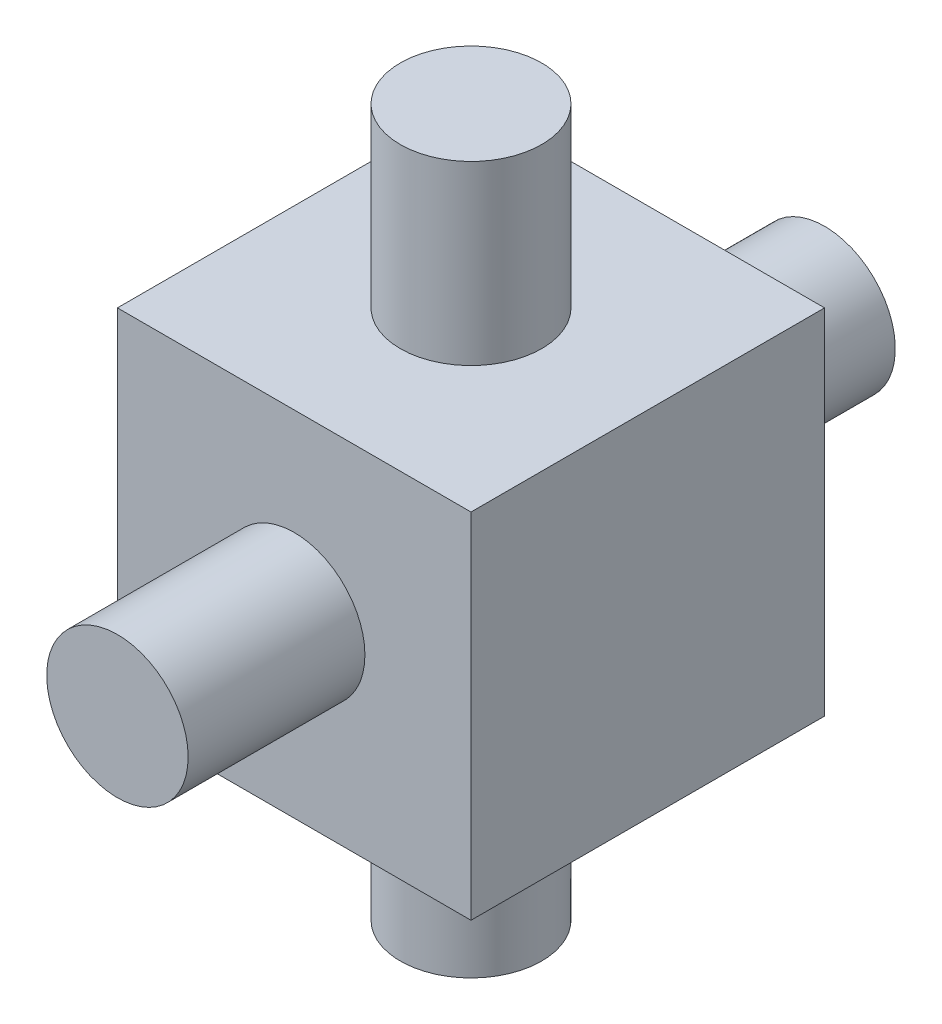
ISO-10303-21;
HEADER;
FILE_DESCRIPTION(('STEP AP214'),'2;1');
FILE_NAME('part.step','',(''),(''),'','','');
FILE_SCHEMA(('AUTOMOTIVE_DESIGN { 1 0 10303 214 1 1 1 1 }'));
ENDSEC;
DATA;
#1=APPLICATION_CONTEXT('core data for automotive mechanical design processes');
#2=APPLICATION_PROTOCOL_DEFINITION('international standard','automotive_design',2000,#1);
#3=PRODUCT_CONTEXT('',#1,'mechanical');
#4=PRODUCT('Part','Part','',(#3));
#5=PRODUCT_RELATED_PRODUCT_CATEGORY('part','',(#4));
#6=PRODUCT_DEFINITION_FORMATION('','',#4);
#7=PRODUCT_DEFINITION_CONTEXT('part definition',#1,'design');
#8=PRODUCT_DEFINITION('design','',#6,#7);
#9=PRODUCT_DEFINITION_SHAPE('','',#8);
#10=(LENGTH_UNIT() NAMED_UNIT(*) SI_UNIT(.MILLI.,.METRE.));
#11=(NAMED_UNIT(*) PLANE_ANGLE_UNIT() SI_UNIT($,.RADIAN.));
#12=(NAMED_UNIT(*) SI_UNIT($,.STERADIAN.) SOLID_ANGLE_UNIT());
#13=UNCERTAINTY_MEASURE_WITH_UNIT(LENGTH_MEASURE(1.E-05),#10,'distance_accuracy_value','');
#14=(GEOMETRIC_REPRESENTATION_CONTEXT(3) GLOBAL_UNCERTAINTY_ASSIGNED_CONTEXT((#13)) GLOBAL_UNIT_ASSIGNED_CONTEXT((#10,
#11,#12)) REPRESENTATION_CONTEXT('',''));
#15=CARTESIAN_POINT('',(0.,0.,0.));
#16=DIRECTION('',(0.,0.,1.));
#17=DIRECTION('',(1.,0.,0.));
#18=AXIS2_PLACEMENT_3D('',#15,#16,#17);
#19=CARTESIAN_POINT('',(10.,10.,-10.));
#20=DIRECTION('',(-1.,0.,0.));
#21=DIRECTION('',(0.,0.,1.));
#22=AXIS2_PLACEMENT_3D('',#19,#20,#21);
#23=PLANE('',#22);
#24=DIRECTION('',(0.,0.,-1.));
#25=VECTOR('',#24,1.);
#26=CARTESIAN_POINT('',(10.,-10.,-10.));
#27=LINE('',#26,#25);
#28=CARTESIAN_POINT('',(10.,-10.,10.));
#29=VERTEX_POINT('',#28);
#30=CARTESIAN_POINT('',(10.,-10.,-10.));
#31=VERTEX_POINT('',#30);
#32=EDGE_CURVE('E102',#29,#31,#27,.T.);
#33=ORIENTED_EDGE('',*,*,#32,.T.);
#34=DIRECTION('',(0.,-1.,0.));
#35=VECTOR('',#34,1.);
#36=CARTESIAN_POINT('',(10.,10.,-10.));
#37=LINE('',#36,#35);
#38=CARTESIAN_POINT('',(10.,10.,-10.));
#39=VERTEX_POINT('',#38);
#40=EDGE_CURVE('E38',#39,#31,#37,.T.);
#41=ORIENTED_EDGE('',*,*,#40,.F.);
#42=DIRECTION('',(0.,0.,-1.));
#43=VECTOR('',#42,1.);
#44=CARTESIAN_POINT('',(10.,10.,-10.));
#45=LINE('',#44,#43);
#46=CARTESIAN_POINT('',(10.,10.,10.));
#47=VERTEX_POINT('',#46);
#48=EDGE_CURVE('E89',#47,#39,#45,.T.);
#49=ORIENTED_EDGE('',*,*,#48,.F.);
#50=DIRECTION('',(0.,-1.,0.));
#51=VECTOR('',#50,1.);
#52=CARTESIAN_POINT('',(10.,10.,10.));
#53=LINE('',#52,#51);
#54=EDGE_CURVE('E98',#47,#29,#53,.T.);
#55=ORIENTED_EDGE('',*,*,#54,.T.);
#56=EDGE_LOOP('',(#33,#41,#49,#55));
#57=FACE_BOUND('',#56,.T.);
#58=ADVANCED_FACE('F35',(#57),#23,.F.);
#59=CARTESIAN_POINT('',(-10.,10.,-10.));
#60=DIRECTION('',(0.,0.,1.));
#61=DIRECTION('',(1.,0.,0.));
#62=AXIS2_PLACEMENT_3D('',#59,#60,#61);
#63=PLANE('',#62);
#64=CARTESIAN_POINT('',(0.,0.,-10.));
#65=DIRECTION('',(0.,0.,-1.));
#66=DIRECTION('',(-1.,0.,0.));
#67=AXIS2_PLACEMENT_3D('',#64,#65,#66);
#68=CIRCLE('',#67,4.);
#69=CARTESIAN_POINT('',(-4.,0.,-10.));
#70=VERTEX_POINT('',#69);
#71=EDGE_CURVE('E116',#70,#70,#68,.T.);
#72=ORIENTED_EDGE('',*,*,#71,.F.);
#73=EDGE_LOOP('',(#72));
#74=FACE_BOUND('',#73,.T.);
#75=DIRECTION('',(-1.,0.,0.));
#76=VECTOR('',#75,1.);
#77=CARTESIAN_POINT('',(-10.,-10.,-10.));
#78=LINE('',#77,#76);
#79=CARTESIAN_POINT('',(-10.,-10.,-10.));
#80=VERTEX_POINT('',#79);
#81=EDGE_CURVE('E94',#31,#80,#78,.T.);
#82=ORIENTED_EDGE('',*,*,#81,.T.);
#83=DIRECTION('',(0.,-1.,0.));
#84=VECTOR('',#83,1.);
#85=CARTESIAN_POINT('',(-10.,10.,-10.));
#86=LINE('',#85,#84);
#87=CARTESIAN_POINT('',(-10.,10.,-10.));
#88=VERTEX_POINT('',#87);
#89=EDGE_CURVE('E92',#88,#80,#86,.T.);
#90=ORIENTED_EDGE('',*,*,#89,.F.);
#91=DIRECTION('',(-1.,0.,0.));
#92=VECTOR('',#91,1.);
#93=CARTESIAN_POINT('',(-10.,10.,-10.));
#94=LINE('',#93,#92);
#95=EDGE_CURVE('E84',#39,#88,#94,.T.);
#96=ORIENTED_EDGE('',*,*,#95,.F.);
#97=ORIENTED_EDGE('',*,*,#40,.T.);
#98=EDGE_LOOP('',(#82,#90,#96,#97));
#99=FACE_BOUND('',#98,.T.);
#100=ADVANCED_FACE('F93',(#74,#99),#63,.F.);
#101=CARTESIAN_POINT('',(-10.,10.,-10.));
#102=DIRECTION('',(1.,0.,0.));
#103=DIRECTION('',(0.,0.,-1.));
#104=AXIS2_PLACEMENT_3D('',#101,#102,#103);
#105=PLANE('',#104);
#106=DIRECTION('',(0.,0.,1.));
#107=VECTOR('',#106,1.);
#108=CARTESIAN_POINT('',(-10.,-10.,-10.));
#109=LINE('',#108,#107);
#110=CARTESIAN_POINT('',(-10.,-10.,10.));
#111=VERTEX_POINT('',#110);
#112=EDGE_CURVE('E70',#80,#111,#109,.T.);
#113=ORIENTED_EDGE('',*,*,#112,.T.);
#114=DIRECTION('',(0.,-1.,0.));
#115=VECTOR('',#114,1.);
#116=CARTESIAN_POINT('',(-10.,10.,10.));
#117=LINE('',#116,#115);
#118=CARTESIAN_POINT('',(-10.,10.,10.));
#119=VERTEX_POINT('',#118);
#120=EDGE_CURVE('E95',#119,#111,#117,.T.);
#121=ORIENTED_EDGE('',*,*,#120,.F.);
#122=DIRECTION('',(0.,0.,1.));
#123=VECTOR('',#122,1.);
#124=CARTESIAN_POINT('',(-10.,10.,-10.));
#125=LINE('',#124,#123);
#126=EDGE_CURVE('E87',#88,#119,#125,.T.);
#127=ORIENTED_EDGE('',*,*,#126,.F.);
#128=ORIENTED_EDGE('',*,*,#89,.T.);
#129=EDGE_LOOP('',(#113,#121,#127,#128));
#130=FACE_BOUND('',#129,.T.);
#131=ADVANCED_FACE('F96',(#130),#105,.F.);
#132=CARTESIAN_POINT('',(-10.,10.,10.));
#133=DIRECTION('',(0.,0.,-1.));
#134=DIRECTION('',(-1.,0.,0.));
#135=AXIS2_PLACEMENT_3D('',#132,#133,#134);
#136=PLANE('',#135);
#137=CARTESIAN_POINT('',(0.,0.,10.));
#138=DIRECTION('',(0.,0.,1.));
#139=DIRECTION('',(1.,0.,0.));
#140=AXIS2_PLACEMENT_3D('',#137,#138,#139);
#141=CIRCLE('',#140,4.);
#142=CARTESIAN_POINT('',(4.,0.,10.));
#143=VERTEX_POINT('',#142);
#144=EDGE_CURVE('E44',#143,#143,#141,.T.);
#145=ORIENTED_EDGE('',*,*,#144,.F.);
#146=EDGE_LOOP('',(#145));
#147=FACE_BOUND('',#146,.T.);
#148=DIRECTION('',(1.,0.,0.));
#149=VECTOR('',#148,1.);
#150=CARTESIAN_POINT('',(-10.,-10.,10.));
#151=LINE('',#150,#149);
#152=EDGE_CURVE('E76',#111,#29,#151,.T.);
#153=ORIENTED_EDGE('',*,*,#152,.T.);
#154=ORIENTED_EDGE('',*,*,#54,.F.);
#155=DIRECTION('',(1.,0.,0.));
#156=VECTOR('',#155,1.);
#157=CARTESIAN_POINT('',(-10.,10.,10.));
#158=LINE('',#157,#156);
#159=EDGE_CURVE('E53',#119,#47,#158,.T.);
#160=ORIENTED_EDGE('',*,*,#159,.F.);
#161=ORIENTED_EDGE('',*,*,#120,.T.);
#162=EDGE_LOOP('',(#153,#154,#160,#161));
#163=FACE_BOUND('',#162,.T.);
#164=ADVANCED_FACE('F110',(#147,#163),#136,.F.);
#165=CARTESIAN_POINT('',(0.,10.,0.));
#166=DIRECTION('',(0.,1.,0.));
#167=DIRECTION('',(0.,0.,1.));
#168=AXIS2_PLACEMENT_3D('',#165,#166,#167);
#169=PLANE('',#168);
#170=CARTESIAN_POINT('',(0.,10.,0.));
#171=DIRECTION('',(0.,1.,0.));
#172=DIRECTION('',(0.,0.,1.));
#173=AXIS2_PLACEMENT_3D('',#170,#171,#172);
#174=CIRCLE('',#173,4.);
#175=CARTESIAN_POINT('',(0.,10.,4.));
#176=VERTEX_POINT('',#175);
#177=EDGE_CURVE('E119',#176,#176,#174,.T.);
#178=ORIENTED_EDGE('',*,*,#177,.F.);
#179=EDGE_LOOP('',(#178));
#180=FACE_BOUND('',#179,.T.);
#181=ORIENTED_EDGE('',*,*,#48,.T.);
#182=ORIENTED_EDGE('',*,*,#95,.T.);
#183=ORIENTED_EDGE('',*,*,#126,.T.);
#184=ORIENTED_EDGE('',*,*,#159,.T.);
#185=EDGE_LOOP('',(#181,#182,#183,#184));
#186=FACE_BOUND('',#185,.T.);
#187=ADVANCED_FACE('F85',(#180,#186),#169,.T.);
#188=CARTESIAN_POINT('',(0.,-10.,0.));
#189=DIRECTION('',(0.,1.,0.));
#190=DIRECTION('',(0.,0.,1.));
#191=AXIS2_PLACEMENT_3D('',#188,#189,#190);
#192=PLANE('',#191);
#193=CARTESIAN_POINT('',(0.,-10.,0.));
#194=DIRECTION('',(0.,-1.,0.));
#195=DIRECTION('',(0.,0.,-1.));
#196=AXIS2_PLACEMENT_3D('',#193,#194,#195);
#197=CIRCLE('',#196,4.);
#198=CARTESIAN_POINT('',(0.,-10.,-4.));
#199=VERTEX_POINT('',#198);
#200=EDGE_CURVE('E11',#199,#199,#197,.T.);
#201=ORIENTED_EDGE('',*,*,#200,.F.);
#202=EDGE_LOOP('',(#201));
#203=FACE_BOUND('',#202,.T.);
#204=ORIENTED_EDGE('',*,*,#32,.F.);
#205=ORIENTED_EDGE('',*,*,#152,.F.);
#206=ORIENTED_EDGE('',*,*,#112,.F.);
#207=ORIENTED_EDGE('',*,*,#81,.F.);
#208=EDGE_LOOP('',(#204,#205,#206,#207));
#209=FACE_BOUND('',#208,.T.);
#210=ADVANCED_FACE('F113',(#203,#209),#192,.F.);
#211=CARTESIAN_POINT('',(0.,0.,-20.));
#212=DIRECTION('',(0.,0.,1.));
#213=DIRECTION('',(1.,0.,0.));
#214=AXIS2_PLACEMENT_3D('',#211,#212,#213);
#215=CYLINDRICAL_SURFACE('',#214,4.);
#216=CARTESIAN_POINT('',(0.,0.,-20.));
#217=DIRECTION('',(0.,0.,-1.));
#218=DIRECTION('',(-1.,0.,0.));
#219=AXIS2_PLACEMENT_3D('',#216,#217,#218);
#220=CIRCLE('',#219,4.);
#221=CARTESIAN_POINT('',(-4.,0.,-20.));
#222=VERTEX_POINT('',#221);
#223=EDGE_CURVE('E105',#222,#222,#220,.T.);
#224=ORIENTED_EDGE('',*,*,#223,.F.);
#225=EDGE_LOOP('',(#224));
#226=FACE_BOUND('',#225,.T.);
#227=ORIENTED_EDGE('',*,*,#71,.T.);
#228=EDGE_LOOP('',(#227));
#229=FACE_BOUND('',#228,.T.);
#230=ADVANCED_FACE('F146',(#226,#229),#215,.T.);
#231=CARTESIAN_POINT('',(0.,0.,-20.));
#232=DIRECTION('',(0.,0.,-1.));
#233=DIRECTION('',(-1.,0.,0.));
#234=AXIS2_PLACEMENT_3D('',#231,#232,#233);
#235=PLANE('',#234);
#236=ORIENTED_EDGE('',*,*,#223,.T.);
#237=EDGE_LOOP('',(#236));
#238=FACE_BOUND('',#237,.T.);
#239=ADVANCED_FACE('F152',(#238),#235,.T.);
#240=CARTESIAN_POINT('',(0.,20.,0.));
#241=DIRECTION('',(0.,-1.,0.));
#242=DIRECTION('',(0.,0.,-1.));
#243=AXIS2_PLACEMENT_3D('',#240,#241,#242);
#244=CYLINDRICAL_SURFACE('',#243,4.);
#245=CARTESIAN_POINT('',(0.,20.,0.));
#246=DIRECTION('',(0.,1.,0.));
#247=DIRECTION('',(0.,0.,1.));
#248=AXIS2_PLACEMENT_3D('',#245,#246,#247);
#249=CIRCLE('',#248,4.);
#250=CARTESIAN_POINT('',(0.,20.,4.));
#251=VERTEX_POINT('',#250);
#252=EDGE_CURVE('E122',#251,#251,#249,.T.);
#253=ORIENTED_EDGE('',*,*,#252,.F.);
#254=EDGE_LOOP('',(#253));
#255=FACE_BOUND('',#254,.T.);
#256=ORIENTED_EDGE('',*,*,#177,.T.);
#257=EDGE_LOOP('',(#256));
#258=FACE_BOUND('',#257,.T.);
#259=ADVANCED_FACE('F185',(#255,#258),#244,.T.);
#260=CARTESIAN_POINT('',(0.,20.,0.));
#261=DIRECTION('',(0.,1.,0.));
#262=DIRECTION('',(0.,0.,1.));
#263=AXIS2_PLACEMENT_3D('',#260,#261,#262);
#264=PLANE('',#263);
#265=ORIENTED_EDGE('',*,*,#252,.T.);
#266=EDGE_LOOP('',(#265));
#267=FACE_BOUND('',#266,.T.);
#268=ADVANCED_FACE('F176',(#267),#264,.T.);
#269=CARTESIAN_POINT('',(0.,0.,20.));
#270=DIRECTION('',(0.,0.,-1.));
#271=DIRECTION('',(-1.,0.,0.));
#272=AXIS2_PLACEMENT_3D('',#269,#270,#271);
#273=CYLINDRICAL_SURFACE('',#272,4.);
#274=CARTESIAN_POINT('',(0.,0.,20.));
#275=DIRECTION('',(0.,0.,1.));
#276=DIRECTION('',(1.,0.,0.));
#277=AXIS2_PLACEMENT_3D('',#274,#275,#276);
#278=CIRCLE('',#277,4.);
#279=CARTESIAN_POINT('',(4.,0.,20.));
#280=VERTEX_POINT('',#279);
#281=EDGE_CURVE('E127',#280,#280,#278,.T.);
#282=ORIENTED_EDGE('',*,*,#281,.F.);
#283=EDGE_LOOP('',(#282));
#284=FACE_BOUND('',#283,.T.);
#285=ORIENTED_EDGE('',*,*,#144,.T.);
#286=EDGE_LOOP('',(#285));
#287=FACE_BOUND('',#286,.T.);
#288=ADVANCED_FACE('F174',(#284,#287),#273,.T.);
#289=CARTESIAN_POINT('',(0.,0.,20.));
#290=DIRECTION('',(0.,0.,1.));
#291=DIRECTION('',(1.,0.,0.));
#292=AXIS2_PLACEMENT_3D('',#289,#290,#291);
#293=PLANE('',#292);
#294=ORIENTED_EDGE('',*,*,#281,.T.);
#295=EDGE_LOOP('',(#294));
#296=FACE_BOUND('',#295,.T.);
#297=ADVANCED_FACE('F141',(#296),#293,.T.);
#298=CARTESIAN_POINT('',(0.,-20.,0.));
#299=DIRECTION('',(0.,1.,0.));
#300=DIRECTION('',(0.,0.,1.));
#301=AXIS2_PLACEMENT_3D('',#298,#299,#300);
#302=CYLINDRICAL_SURFACE('',#301,4.);
#303=CARTESIAN_POINT('',(0.,-20.,0.));
#304=DIRECTION('',(0.,-1.,0.));
#305=DIRECTION('',(0.,0.,-1.));
#306=AXIS2_PLACEMENT_3D('',#303,#304,#305);
#307=CIRCLE('',#306,4.);
#308=CARTESIAN_POINT('',(0.,-20.,-4.));
#309=VERTEX_POINT('',#308);
#310=EDGE_CURVE('E131',#309,#309,#307,.T.);
#311=ORIENTED_EDGE('',*,*,#310,.F.);
#312=EDGE_LOOP('',(#311));
#313=FACE_BOUND('',#312,.T.);
#314=ORIENTED_EDGE('',*,*,#200,.T.);
#315=EDGE_LOOP('',(#314));
#316=FACE_BOUND('',#315,.T.);
#317=ADVANCED_FACE('F138',(#313,#316),#302,.T.);
#318=CARTESIAN_POINT('',(0.,-20.,0.));
#319=DIRECTION('',(0.,-1.,0.));
#320=DIRECTION('',(0.,0.,-1.));
#321=AXIS2_PLACEMENT_3D('',#318,#319,#320);
#322=PLANE('',#321);
#323=ORIENTED_EDGE('',*,*,#310,.T.);
#324=EDGE_LOOP('',(#323));
#325=FACE_BOUND('',#324,.T.);
#326=ADVANCED_FACE('F136',(#325),#322,.T.);
#327=CLOSED_SHELL('',(#58,#100,#131,#164,#187,#210,#230,#239,#259,#268,#288,#297,#317,#326));
#328=MANIFOLD_SOLID_BREP('B2',#327);
#329=ADVANCED_BREP_SHAPE_REPRESENTATION('',(#18,#328),#14);
#330=SHAPE_DEFINITION_REPRESENTATION(#9,#329);
ENDSEC;
END-ISO-10303-21;
